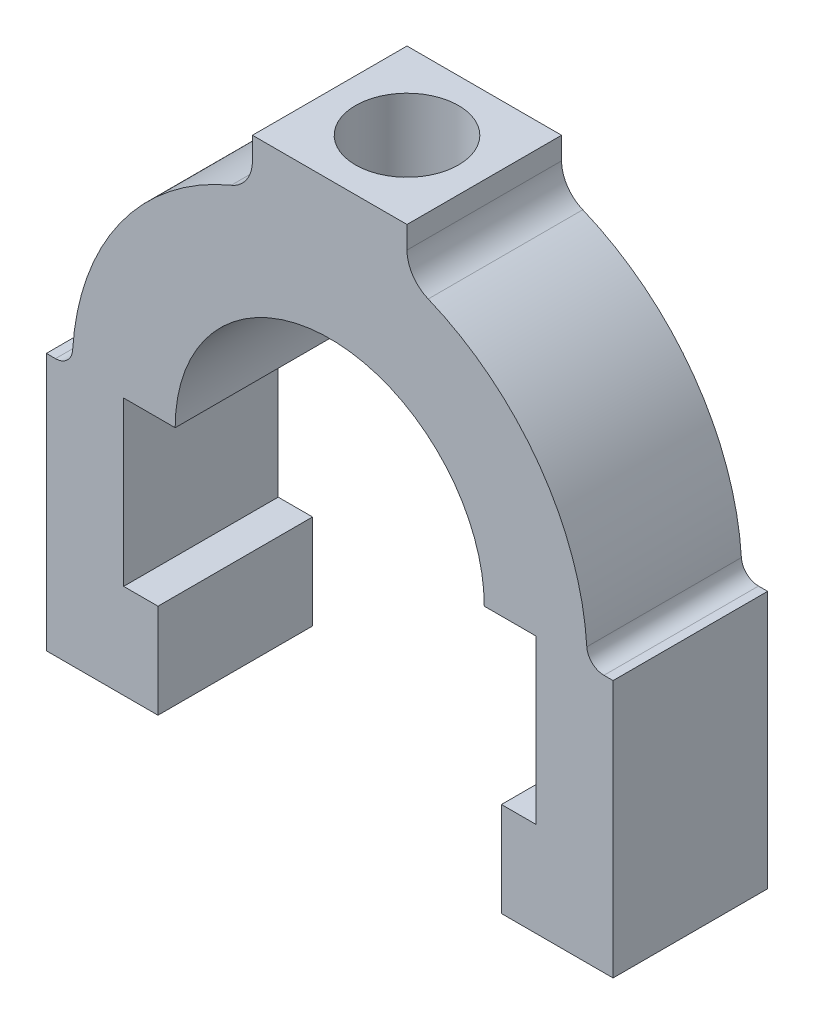
ISO-10303-21;
HEADER;
FILE_DESCRIPTION(('STEP AP214'),'2;1');
FILE_NAME('part.step','',(''),(''),'','','');
FILE_SCHEMA(('AUTOMOTIVE_DESIGN { 1 0 10303 214 1 1 1 1 }'));
ENDSEC;
DATA;
#1=APPLICATION_CONTEXT('core data for automotive mechanical design processes');
#2=APPLICATION_PROTOCOL_DEFINITION('international standard','automotive_design',2000,#1);
#3=PRODUCT_CONTEXT('',#1,'mechanical');
#4=PRODUCT('Part','Part','',(#3));
#5=PRODUCT_RELATED_PRODUCT_CATEGORY('part','',(#4));
#6=PRODUCT_DEFINITION_FORMATION('','',#4);
#7=PRODUCT_DEFINITION_CONTEXT('part definition',#1,'design');
#8=PRODUCT_DEFINITION('design','',#6,#7);
#9=PRODUCT_DEFINITION_SHAPE('','',#8);
#10=(LENGTH_UNIT() NAMED_UNIT(*) SI_UNIT(.MILLI.,.METRE.));
#11=(NAMED_UNIT(*) PLANE_ANGLE_UNIT() SI_UNIT($,.RADIAN.));
#12=(NAMED_UNIT(*) SI_UNIT($,.STERADIAN.) SOLID_ANGLE_UNIT());
#13=UNCERTAINTY_MEASURE_WITH_UNIT(LENGTH_MEASURE(1.E-05),#10,'distance_accuracy_value','');
#14=(GEOMETRIC_REPRESENTATION_CONTEXT(3) GLOBAL_UNCERTAINTY_ASSIGNED_CONTEXT((#13)) GLOBAL_UNIT_ASSIGNED_CONTEXT((#10,
#11,#12)) REPRESENTATION_CONTEXT('',''));
#15=CARTESIAN_POINT('',(0.,0.,0.));
#16=DIRECTION('',(0.,0.,1.));
#17=DIRECTION('',(1.,0.,0.));
#18=AXIS2_PLACEMENT_3D('',#15,#16,#17);
#19=CARTESIAN_POINT('',(-9.,34.,9.));
#20=DIRECTION('',(0.,-1.,0.));
#21=DIRECTION('',(0.,0.,-1.));
#22=AXIS2_PLACEMENT_3D('',#19,#20,#21);
#23=PLANE('',#22);
#24=DIRECTION('',(-1.,0.,0.));
#25=VECTOR('',#24,1.);
#26=CARTESIAN_POINT('',(-9.,34.,-9.));
#27=LINE('',#26,#25);
#28=CARTESIAN_POINT('',(9.,34.,-9.));
#29=VERTEX_POINT('',#28);
#30=CARTESIAN_POINT('',(-9.,34.,-9.));
#31=VERTEX_POINT('',#30);
#32=EDGE_CURVE('E267',#29,#31,#27,.T.);
#33=ORIENTED_EDGE('',*,*,#32,.T.);
#34=DIRECTION('',(0.,0.,-1.));
#35=VECTOR('',#34,1.);
#36=CARTESIAN_POINT('',(-9.,34.,9.));
#37=LINE('',#36,#35);
#38=CARTESIAN_POINT('',(-9.,34.,9.));
#39=VERTEX_POINT('',#38);
#40=EDGE_CURVE('E225',#39,#31,#37,.T.);
#41=ORIENTED_EDGE('',*,*,#40,.F.);
#42=DIRECTION('',(-1.,0.,0.));
#43=VECTOR('',#42,1.);
#44=CARTESIAN_POINT('',(-9.,34.,9.));
#45=LINE('',#44,#43);
#46=CARTESIAN_POINT('',(9.,34.,9.));
#47=VERTEX_POINT('',#46);
#48=EDGE_CURVE('E202',#47,#39,#45,.T.);
#49=ORIENTED_EDGE('',*,*,#48,.F.);
#50=DIRECTION('',(0.,0.,-1.));
#51=VECTOR('',#50,1.);
#52=CARTESIAN_POINT('',(9.,34.,9.));
#53=LINE('',#52,#51);
#54=EDGE_CURVE('E214',#47,#29,#53,.T.);
#55=ORIENTED_EDGE('',*,*,#54,.T.);
#56=EDGE_LOOP('',(#33,#41,#49,#55));
#57=FACE_BOUND('',#56,.T.);
#58=CARTESIAN_POINT('',(0.,34.,0.));
#59=DIRECTION('',(0.,1.,0.));
#60=DIRECTION('',(0.,0.,1.));
#61=AXIS2_PLACEMENT_3D('',#58,#59,#60);
#62=CIRCLE('',#61,6.00000000000001);
#63=CARTESIAN_POINT('',(0.,34.,6.00000000000001));
#64=VERTEX_POINT('',#63);
#65=EDGE_CURVE('E518',#64,#64,#62,.T.);
#66=ORIENTED_EDGE('',*,*,#65,.F.);
#67=EDGE_LOOP('',(#66));
#68=FACE_BOUND('',#67,.T.);
#69=ADVANCED_FACE('F39',(#57,#68),#23,.F.);
#70=CARTESIAN_POINT('',(0.,0.,9.));
#71=DIRECTION('',(0.,0.,-1.));
#72=DIRECTION('',(-1.,0.,0.));
#73=AXIS2_PLACEMENT_3D('',#70,#71,#72);
#74=CYLINDRICAL_SURFACE('',#73,30.);
#75=CARTESIAN_POINT('',(0.,0.,9.));
#76=DIRECTION('',(0.,0.,1.));
#77=DIRECTION('',(1.,0.,0.));
#78=AXIS2_PLACEMENT_3D('',#75,#76,#77);
#79=CIRCLE('',#78,30.);
#80=CARTESIAN_POINT('',(29.9413489175087,1.875,9.));
#81=VERTEX_POINT('',#80);
#82=CARTESIAN_POINT('',(11.4705882352941,27.7204907160088,9.));
#83=VERTEX_POINT('',#82);
#84=EDGE_CURVE('E215',#81,#83,#79,.T.);
#85=ORIENTED_EDGE('',*,*,#84,.F.);
#86=DIRECTION('',(0.,0.,-1.));
#87=VECTOR('',#86,1.);
#88=CARTESIAN_POINT('',(29.9413489175087,1.875,9.));
#89=LINE('',#88,#87);
#90=CARTESIAN_POINT('',(29.9413489175087,1.875,-9.));
#91=VERTEX_POINT('',#90);
#92=EDGE_CURVE('E368',#81,#91,#89,.T.);
#93=ORIENTED_EDGE('',*,*,#92,.T.);
#94=CARTESIAN_POINT('',(0.,0.,-9.));
#95=DIRECTION('',(0.,0.,1.));
#96=DIRECTION('',(1.,0.,0.));
#97=AXIS2_PLACEMENT_3D('',#94,#95,#96);
#98=CIRCLE('',#97,30.);
#99=CARTESIAN_POINT('',(11.4705882352941,27.7204907160088,-9.));
#100=VERTEX_POINT('',#99);
#101=EDGE_CURVE('E264',#91,#100,#98,.T.);
#102=ORIENTED_EDGE('',*,*,#101,.T.);
#103=DIRECTION('',(0.,0.,-1.));
#104=VECTOR('',#103,1.);
#105=CARTESIAN_POINT('',(11.4705882352941,27.7204907160088,9.));
#106=LINE('',#105,#104);
#107=EDGE_CURVE('E353',#100,#83,#106,.F.);
#108=ORIENTED_EDGE('',*,*,#107,.T.);
#109=EDGE_LOOP('',(#85,#93,#102,#108));
#110=FACE_BOUND('',#109,.T.);
#111=ADVANCED_FACE('F384',(#110),#74,.T.);
#112=CARTESIAN_POINT('',(9.,34.,9.));
#113=DIRECTION('',(-1.,0.,0.));
#114=DIRECTION('',(0.,0.,1.));
#115=AXIS2_PLACEMENT_3D('',#112,#113,#114);
#116=PLANE('',#115);
#117=DIRECTION('',(0.,1.,0.));
#118=VECTOR('',#117,1.);
#119=CARTESIAN_POINT('',(9.,34.,9.));
#120=LINE('',#119,#118);
#121=CARTESIAN_POINT('',(9.,31.41655614481,9.));
#122=VERTEX_POINT('',#121);
#123=EDGE_CURVE('E200',#122,#47,#120,.T.);
#124=ORIENTED_EDGE('',*,*,#123,.F.);
#125=DIRECTION('',(0.,0.,1.));
#126=VECTOR('',#125,1.);
#127=CARTESIAN_POINT('',(9.,31.41655614481,-9.));
#128=LINE('',#127,#126);
#129=CARTESIAN_POINT('',(9.,31.41655614481,-9.));
#130=VERTEX_POINT('',#129);
#131=EDGE_CURVE('E354',#122,#130,#128,.F.);
#132=ORIENTED_EDGE('',*,*,#131,.T.);
#133=DIRECTION('',(0.,1.,0.));
#134=VECTOR('',#133,1.);
#135=CARTESIAN_POINT('',(9.,34.,-9.));
#136=LINE('',#135,#134);
#137=EDGE_CURVE('E217',#130,#29,#136,.T.);
#138=ORIENTED_EDGE('',*,*,#137,.T.);
#139=ORIENTED_EDGE('',*,*,#54,.F.);
#140=EDGE_LOOP('',(#124,#132,#138,#139));
#141=FACE_BOUND('',#140,.T.);
#142=ADVANCED_FACE('F216',(#141),#116,.F.);
#143=CARTESIAN_POINT('',(-9.,28.6181760425084,9.));
#144=DIRECTION('',(1.,0.,0.));
#145=DIRECTION('',(0.,0.,-1.));
#146=AXIS2_PLACEMENT_3D('',#143,#144,#145);
#147=PLANE('',#146);
#148=DIRECTION('',(0.,-1.,0.));
#149=VECTOR('',#148,1.);
#150=CARTESIAN_POINT('',(-9.,28.6181760425084,-9.));
#151=LINE('',#150,#149);
#152=CARTESIAN_POINT('',(-9.,31.41655614481,-9.));
#153=VERTEX_POINT('',#152);
#154=EDGE_CURVE('E271',#31,#153,#151,.T.);
#155=ORIENTED_EDGE('',*,*,#154,.T.);
#156=DIRECTION('',(0.,0.,1.));
#157=VECTOR('',#156,1.);
#158=CARTESIAN_POINT('',(-9.,31.41655614481,9.));
#159=LINE('',#158,#157);
#160=CARTESIAN_POINT('',(-9.,31.41655614481,9.));
#161=VERTEX_POINT('',#160);
#162=EDGE_CURVE('E352',#153,#161,#159,.T.);
#163=ORIENTED_EDGE('',*,*,#162,.T.);
#164=DIRECTION('',(0.,-1.,0.));
#165=VECTOR('',#164,1.);
#166=CARTESIAN_POINT('',(-9.,28.6181760425084,9.));
#167=LINE('',#166,#165);
#168=EDGE_CURVE('E230',#39,#161,#167,.T.);
#169=ORIENTED_EDGE('',*,*,#168,.F.);
#170=ORIENTED_EDGE('',*,*,#40,.T.);
#171=EDGE_LOOP('',(#155,#163,#169,#170));
#172=FACE_BOUND('',#171,.T.);
#173=ADVANCED_FACE('F471',(#172),#147,.F.);
#174=CARTESIAN_POINT('',(0.,0.,9.));
#175=DIRECTION('',(0.,0.,-1.));
#176=DIRECTION('',(-1.,0.,0.));
#177=AXIS2_PLACEMENT_3D('',#174,#175,#176);
#178=CYLINDRICAL_SURFACE('',#177,30.);
#179=CARTESIAN_POINT('',(0.,0.,-9.));
#180=DIRECTION('',(0.,0.,1.));
#181=DIRECTION('',(1.,0.,0.));
#182=AXIS2_PLACEMENT_3D('',#179,#180,#181);
#183=CIRCLE('',#182,30.);
#184=CARTESIAN_POINT('',(-11.4705882352941,27.7204907160088,-9.));
#185=VERTEX_POINT('',#184);
#186=CARTESIAN_POINT('',(-29.9413489175087,1.875,-9.));
#187=VERTEX_POINT('',#186);
#188=EDGE_CURVE('E273',#185,#187,#183,.T.);
#189=ORIENTED_EDGE('',*,*,#188,.T.);
#190=DIRECTION('',(0.,0.,-1.));
#191=VECTOR('',#190,1.);
#192=CARTESIAN_POINT('',(-29.9413489175087,1.875,9.));
#193=LINE('',#192,#191);
#194=CARTESIAN_POINT('',(-29.9413489175087,1.875,9.));
#195=VERTEX_POINT('',#194);
#196=EDGE_CURVE('E58',#187,#195,#193,.F.);
#197=ORIENTED_EDGE('',*,*,#196,.T.);
#198=CARTESIAN_POINT('',(0.,0.,9.));
#199=DIRECTION('',(0.,0.,1.));
#200=DIRECTION('',(1.,0.,0.));
#201=AXIS2_PLACEMENT_3D('',#198,#199,#200);
#202=CIRCLE('',#201,30.);
#203=CARTESIAN_POINT('',(-11.4705882352941,27.7204907160088,9.));
#204=VERTEX_POINT('',#203);
#205=EDGE_CURVE('E226',#204,#195,#202,.T.);
#206=ORIENTED_EDGE('',*,*,#205,.F.);
#207=DIRECTION('',(0.,0.,-1.));
#208=VECTOR('',#207,1.);
#209=CARTESIAN_POINT('',(-11.4705882352941,27.7204907160088,9.));
#210=LINE('',#209,#208);
#211=EDGE_CURVE('E222',#204,#185,#210,.T.);
#212=ORIENTED_EDGE('',*,*,#211,.T.);
#213=EDGE_LOOP('',(#189,#197,#206,#212));
#214=FACE_BOUND('',#213,.T.);
#215=ADVANCED_FACE('F470',(#214),#178,.T.);
#216=CARTESIAN_POINT('',(-33.,0.,9.));
#217=DIRECTION('',(0.,-1.,0.));
#218=DIRECTION('',(0.,0.,-1.));
#219=AXIS2_PLACEMENT_3D('',#216,#217,#218);
#220=PLANE('',#219);
#221=DIRECTION('',(-1.,0.,0.));
#222=VECTOR('',#221,1.);
#223=CARTESIAN_POINT('',(-33.,0.,9.));
#224=LINE('',#223,#222);
#225=CARTESIAN_POINT('',(-31.9374388453426,0.,9.));
#226=VERTEX_POINT('',#225);
#227=CARTESIAN_POINT('',(-33.,0.,9.));
#228=VERTEX_POINT('',#227);
#229=EDGE_CURVE('E234',#226,#228,#224,.T.);
#230=ORIENTED_EDGE('',*,*,#229,.F.);
#231=DIRECTION('',(0.,0.,1.));
#232=VECTOR('',#231,1.);
#233=CARTESIAN_POINT('',(-31.9374388453426,0.,-9.));
#234=LINE('',#233,#232);
#235=CARTESIAN_POINT('',(-31.9374388453426,0.,-9.));
#236=VERTEX_POINT('',#235);
#237=EDGE_CURVE('E371',#226,#236,#234,.F.);
#238=ORIENTED_EDGE('',*,*,#237,.T.);
#239=DIRECTION('',(-1.,0.,0.));
#240=VECTOR('',#239,1.);
#241=CARTESIAN_POINT('',(-33.,0.,-9.));
#242=LINE('',#241,#240);
#243=CARTESIAN_POINT('',(-33.,0.,-9.));
#244=VERTEX_POINT('',#243);
#245=EDGE_CURVE('E277',#236,#244,#242,.T.);
#246=ORIENTED_EDGE('',*,*,#245,.T.);
#247=DIRECTION('',(0.,0.,-1.));
#248=VECTOR('',#247,1.);
#249=CARTESIAN_POINT('',(-33.,0.,9.));
#250=LINE('',#249,#248);
#251=EDGE_CURVE('E342',#228,#244,#250,.T.);
#252=ORIENTED_EDGE('',*,*,#251,.F.);
#253=EDGE_LOOP('',(#230,#238,#246,#252));
#254=FACE_BOUND('',#253,.T.);
#255=ADVANCED_FACE('F462',(#254),#220,.F.);
#256=CARTESIAN_POINT('',(-33.,-30.,9.));
#257=DIRECTION('',(1.,0.,0.));
#258=DIRECTION('',(0.,0.,-1.));
#259=AXIS2_PLACEMENT_3D('',#256,#257,#258);
#260=PLANE('',#259);
#261=DIRECTION('',(0.,-1.,0.));
#262=VECTOR('',#261,1.);
#263=CARTESIAN_POINT('',(-33.,-30.,-9.));
#264=LINE('',#263,#262);
#265=CARTESIAN_POINT('',(-33.,-30.,-9.));
#266=VERTEX_POINT('',#265);
#267=EDGE_CURVE('E279',#244,#266,#264,.T.);
#268=ORIENTED_EDGE('',*,*,#267,.T.);
#269=DIRECTION('',(0.,0.,-1.));
#270=VECTOR('',#269,1.);
#271=CARTESIAN_POINT('',(-33.,-30.,9.));
#272=LINE('',#271,#270);
#273=CARTESIAN_POINT('',(-33.,-30.,9.));
#274=VERTEX_POINT('',#273);
#275=EDGE_CURVE('E345',#274,#266,#272,.T.);
#276=ORIENTED_EDGE('',*,*,#275,.F.);
#277=DIRECTION('',(0.,-1.,0.));
#278=VECTOR('',#277,1.);
#279=CARTESIAN_POINT('',(-33.,-30.,9.));
#280=LINE('',#279,#278);
#281=EDGE_CURVE('E237',#228,#274,#280,.T.);
#282=ORIENTED_EDGE('',*,*,#281,.F.);
#283=ORIENTED_EDGE('',*,*,#251,.T.);
#284=EDGE_LOOP('',(#268,#276,#282,#283));
#285=FACE_BOUND('',#284,.T.);
#286=ADVANCED_FACE('F460',(#285),#260,.F.);
#287=CARTESIAN_POINT('',(-20.,-30.,9.));
#288=DIRECTION('',(0.,1.,0.));
#289=DIRECTION('',(0.,0.,1.));
#290=AXIS2_PLACEMENT_3D('',#287,#288,#289);
#291=PLANE('',#290);
#292=DIRECTION('',(1.,0.,0.));
#293=VECTOR('',#292,1.);
#294=CARTESIAN_POINT('',(-20.,-30.,-9.));
#295=LINE('',#294,#293);
#296=CARTESIAN_POINT('',(-20.,-30.,-9.));
#297=VERTEX_POINT('',#296);
#298=EDGE_CURVE('E278',#266,#297,#295,.T.);
#299=ORIENTED_EDGE('',*,*,#298,.T.);
#300=DIRECTION('',(0.,0.,-1.));
#301=VECTOR('',#300,1.);
#302=CARTESIAN_POINT('',(-20.,-30.,9.));
#303=LINE('',#302,#301);
#304=CARTESIAN_POINT('',(-20.,-30.,9.));
#305=VERTEX_POINT('',#304);
#306=EDGE_CURVE('E336',#305,#297,#303,.T.);
#307=ORIENTED_EDGE('',*,*,#306,.F.);
#308=DIRECTION('',(1.,0.,0.));
#309=VECTOR('',#308,1.);
#310=CARTESIAN_POINT('',(-20.,-30.,9.));
#311=LINE('',#310,#309);
#312=EDGE_CURVE('E236',#274,#305,#311,.T.);
#313=ORIENTED_EDGE('',*,*,#312,.F.);
#314=ORIENTED_EDGE('',*,*,#275,.T.);
#315=EDGE_LOOP('',(#299,#307,#313,#314));
#316=FACE_BOUND('',#315,.T.);
#317=ADVANCED_FACE('F451',(#316),#291,.F.);
#318=CARTESIAN_POINT('',(-20.,-19.,9.));
#319=DIRECTION('',(-1.,0.,0.));
#320=DIRECTION('',(0.,-1.,0.));
#321=AXIS2_PLACEMENT_3D('',#318,#319,#320);
#322=PLANE('',#321);
#323=DIRECTION('',(0.,1.,0.));
#324=VECTOR('',#323,1.);
#325=CARTESIAN_POINT('',(-20.,-19.,-9.));
#326=LINE('',#325,#324);
#327=CARTESIAN_POINT('',(-20.,-19.,-9.));
#328=VERTEX_POINT('',#327);
#329=EDGE_CURVE('E285',#297,#328,#326,.T.);
#330=ORIENTED_EDGE('',*,*,#329,.T.);
#331=DIRECTION('',(0.,0.,-1.));
#332=VECTOR('',#331,1.);
#333=CARTESIAN_POINT('',(-20.,-19.,9.));
#334=LINE('',#333,#332);
#335=CARTESIAN_POINT('',(-20.,-19.,9.));
#336=VERTEX_POINT('',#335);
#337=EDGE_CURVE('E337',#336,#328,#334,.T.);
#338=ORIENTED_EDGE('',*,*,#337,.F.);
#339=DIRECTION('',(0.,1.,0.));
#340=VECTOR('',#339,1.);
#341=CARTESIAN_POINT('',(-20.,-19.,9.));
#342=LINE('',#341,#340);
#343=EDGE_CURVE('E238',#305,#336,#342,.T.);
#344=ORIENTED_EDGE('',*,*,#343,.F.);
#345=ORIENTED_EDGE('',*,*,#306,.T.);
#346=EDGE_LOOP('',(#330,#338,#344,#345));
#347=FACE_BOUND('',#346,.T.);
#348=ADVANCED_FACE('F449',(#347),#322,.F.);
#349=CARTESIAN_POINT('',(-24.,-19.,9.));
#350=DIRECTION('',(0.,-1.,0.));
#351=DIRECTION('',(0.,0.,-1.));
#352=AXIS2_PLACEMENT_3D('',#349,#350,#351);
#353=PLANE('',#352);
#354=DIRECTION('',(-1.,0.,0.));
#355=VECTOR('',#354,1.);
#356=CARTESIAN_POINT('',(-24.,-19.,-9.));
#357=LINE('',#356,#355);
#358=CARTESIAN_POINT('',(-24.,-19.,-9.));
#359=VERTEX_POINT('',#358);
#360=EDGE_CURVE('E281',#328,#359,#357,.T.);
#361=ORIENTED_EDGE('',*,*,#360,.T.);
#362=DIRECTION('',(0.,0.,-1.));
#363=VECTOR('',#362,1.);
#364=CARTESIAN_POINT('',(-24.,-19.,9.));
#365=LINE('',#364,#363);
#366=CARTESIAN_POINT('',(-24.,-19.,9.));
#367=VERTEX_POINT('',#366);
#368=EDGE_CURVE('E334',#367,#359,#365,.T.);
#369=ORIENTED_EDGE('',*,*,#368,.F.);
#370=DIRECTION('',(-1.,0.,0.));
#371=VECTOR('',#370,1.);
#372=CARTESIAN_POINT('',(-24.,-19.,9.));
#373=LINE('',#372,#371);
#374=EDGE_CURVE('E245',#336,#367,#373,.T.);
#375=ORIENTED_EDGE('',*,*,#374,.F.);
#376=ORIENTED_EDGE('',*,*,#337,.T.);
#377=EDGE_LOOP('',(#361,#369,#375,#376));
#378=FACE_BOUND('',#377,.T.);
#379=ADVANCED_FACE('F445',(#378),#353,.F.);
#380=CARTESIAN_POINT('',(-24.,0.,9.));
#381=DIRECTION('',(-1.,0.,0.));
#382=DIRECTION('',(0.,-1.,0.));
#383=AXIS2_PLACEMENT_3D('',#380,#381,#382);
#384=PLANE('',#383);
#385=DIRECTION('',(0.,1.,0.));
#386=VECTOR('',#385,1.);
#387=CARTESIAN_POINT('',(-24.,0.,-9.));
#388=LINE('',#387,#386);
#389=CARTESIAN_POINT('',(-24.,0.,-9.));
#390=VERTEX_POINT('',#389);
#391=EDGE_CURVE('E288',#359,#390,#388,.T.);
#392=ORIENTED_EDGE('',*,*,#391,.T.);
#393=DIRECTION('',(0.,0.,-1.));
#394=VECTOR('',#393,1.);
#395=CARTESIAN_POINT('',(-24.,0.,9.));
#396=LINE('',#395,#394);
#397=CARTESIAN_POINT('',(-24.,0.,9.));
#398=VERTEX_POINT('',#397);
#399=EDGE_CURVE('E329',#398,#390,#396,.T.);
#400=ORIENTED_EDGE('',*,*,#399,.F.);
#401=DIRECTION('',(0.,1.,0.));
#402=VECTOR('',#401,1.);
#403=CARTESIAN_POINT('',(-24.,0.,9.));
#404=LINE('',#403,#402);
#405=EDGE_CURVE('E241',#367,#398,#404,.T.);
#406=ORIENTED_EDGE('',*,*,#405,.F.);
#407=ORIENTED_EDGE('',*,*,#368,.T.);
#408=EDGE_LOOP('',(#392,#400,#406,#407));
#409=FACE_BOUND('',#408,.T.);
#410=ADVANCED_FACE('F437',(#409),#384,.F.);
#411=CARTESIAN_POINT('',(-18.,0.,9.));
#412=DIRECTION('',(0.,1.,0.));
#413=DIRECTION('',(-1.,0.,0.));
#414=AXIS2_PLACEMENT_3D('',#411,#412,#413);
#415=PLANE('',#414);
#416=DIRECTION('',(1.,0.,0.));
#417=VECTOR('',#416,1.);
#418=CARTESIAN_POINT('',(-18.,0.,-9.));
#419=LINE('',#418,#417);
#420=CARTESIAN_POINT('',(-18.,0.,-9.));
#421=VERTEX_POINT('',#420);
#422=EDGE_CURVE('E286',#390,#421,#419,.T.);
#423=ORIENTED_EDGE('',*,*,#422,.T.);
#424=DIRECTION('',(0.,0.,-1.));
#425=VECTOR('',#424,1.);
#426=CARTESIAN_POINT('',(-18.,0.,9.));
#427=LINE('',#426,#425);
#428=CARTESIAN_POINT('',(-18.,0.,9.));
#429=VERTEX_POINT('',#428);
#430=EDGE_CURVE('E330',#429,#421,#427,.T.);
#431=ORIENTED_EDGE('',*,*,#430,.F.);
#432=DIRECTION('',(1.,0.,0.));
#433=VECTOR('',#432,1.);
#434=CARTESIAN_POINT('',(-18.,0.,9.));
#435=LINE('',#434,#433);
#436=EDGE_CURVE('E248',#398,#429,#435,.T.);
#437=ORIENTED_EDGE('',*,*,#436,.F.);
#438=ORIENTED_EDGE('',*,*,#399,.T.);
#439=EDGE_LOOP('',(#423,#431,#437,#438));
#440=FACE_BOUND('',#439,.T.);
#441=ADVANCED_FACE('F433',(#440),#415,.F.);
#442=CARTESIAN_POINT('',(0.,0.,9.));
#443=DIRECTION('',(0.,0.,-1.));
#444=DIRECTION('',(-1.,0.,0.));
#445=AXIS2_PLACEMENT_3D('',#442,#443,#444);
#446=CYLINDRICAL_SURFACE('',#445,18.);
#447=CARTESIAN_POINT('',(0.,18.,6.00000000000001));
#448=CARTESIAN_POINT('',(0.327379650289655,18.000001123506,6.0000023265047));
#449=CARTESIAN_POINT('',(0.654748688533562,17.9909867942918,5.97312070517746));
#450=CARTESIAN_POINT('',(1.29985304419291,17.9559119882929,5.86662304491696));
#451=CARTESIAN_POINT('',(1.61758735790782,17.9298497418759,5.78700153139131));
#452=CARTESIAN_POINT('',(2.23398736346928,17.8635207608215,5.57809293059833));
#453=CARTESIAN_POINT('',(2.53268396310175,17.8232777801419,5.44888886636663));
#454=CARTESIAN_POINT('',(3.1042846199529,17.7326582250689,5.14472171568156));
#455=CARTESIAN_POINT('',(3.37718357480982,17.6822796521554,4.96974960271144));
#456=CARTESIAN_POINT('',(3.76616319556052,17.6021139762513,4.67373393790122));
#457=CARTESIAN_POINT('',(3.8942294180292,17.5741584828372,4.56756247056504));
#458=CARTESIAN_POINT('',(4.14103139160447,17.5176437471481,4.34504566324369));
#459=CARTESIAN_POINT('',(4.25977020760167,17.4890847071399,4.22870369195644));
#460=CARTESIAN_POINT('',(4.48726302616458,17.4321038412202,3.98649013598117));
#461=CARTESIAN_POINT('',(4.59601129158695,17.4036821029209,3.86061315050774));
#462=CARTESIAN_POINT('',(4.80273826983802,17.3477712002834,3.60018484220802));
#463=CARTESIAN_POINT('',(4.90072088829396,17.3202817002612,3.46563669345216));
#464=CARTESIAN_POINT('',(5.08800724585023,17.2662087032665,3.18457637712881));
#465=CARTESIAN_POINT('',(5.17697354503101,17.2396751826829,3.03782944671992));
#466=CARTESIAN_POINT('',(5.34214016777295,17.1892116232901,2.736964636426));
#467=CARTESIAN_POINT('',(5.41834554335251,17.1652805554979,2.58284970472632));
#468=CARTESIAN_POINT('',(5.55741169583797,17.1207625674418,2.2682071931852));
#469=CARTESIAN_POINT('',(5.62027009739617,17.1001762425913,2.10767847791904));
#470=CARTESIAN_POINT('',(5.73202691492454,17.0630401245342,1.78145414427482));
#471=CARTESIAN_POINT('',(5.78093169214337,17.0464884924745,1.615760918658));
#472=CARTESIAN_POINT('',(5.86294638495678,17.0184510407943,1.2859862068502));
#473=CARTESIAN_POINT('',(5.89652807287009,17.0068148729862,1.12203481043606));
#474=CARTESIAN_POINT('',(5.94988922941377,16.9882200160252,0.79170422793202));
#475=CARTESIAN_POINT('',(5.96967445275638,16.981259376684,0.625326083675578));
#476=CARTESIAN_POINT('',(5.99526000389047,16.972243291642,0.291376402534221));
#477=CARTESIAN_POINT('',(6.00106129575105,16.9701875077948,0.123804948716408));
#478=CARTESIAN_POINT('',(5.99862030680245,16.9710505580302,-0.211220264603541));
#479=CARTESIAN_POINT('',(5.99037842226284,16.9739692517434,-0.378674027293289));
#480=CARTESIAN_POINT('',(5.96063984942074,16.9844341754675,-0.7044792823855));
#481=CARTESIAN_POINT('',(5.93976958041475,16.9917616219287,-0.862895480150735));
#482=CARTESIAN_POINT('',(5.88551353932248,17.0106306342449,-1.17736899795067));
#483=CARTESIAN_POINT('',(5.8521235554091,17.0221736182384,-1.33342550574807));
#484=CARTESIAN_POINT('',(5.7731374155462,17.0491237940853,-1.64202527661949));
#485=CARTESIAN_POINT('',(5.72754467937087,17.0645299032367,-1.79456951100698));
#486=CARTESIAN_POINT('',(5.62451111134525,17.0987666198765,-2.09526716026518));
#487=CARTESIAN_POINT('',(5.5670657806024,17.1175985273741,-2.24341888337636));
#488=CARTESIAN_POINT('',(5.43978996961935,17.1584737023369,-2.53665776063388));
#489=CARTESIAN_POINT('',(5.36977902106655,17.1805627911335,-2.68166015095766));
#490=CARTESIAN_POINT('',(5.21849496708249,17.2271173682882,-2.96532612102853));
#491=CARTESIAN_POINT('',(5.13721801376243,17.2515836677221,-3.1039875134049));
#492=CARTESIAN_POINT('',(4.96396506342481,17.3022308894506,-3.37413724932027));
#493=CARTESIAN_POINT('',(4.87198833374049,17.3284119291083,-3.50562510074467));
#494=CARTESIAN_POINT('',(4.67791711233443,17.3818071133135,-3.76068799264569));
#495=CARTESIAN_POINT('',(4.57582226284314,17.4090212943713,-3.8842627530665));
#496=CARTESIAN_POINT('',(4.35651092167621,17.4652307681598,-4.12906952466076));
#497=CARTESIAN_POINT('',(4.23878222552779,17.4942446291105,-4.24983892079909));
#498=CARTESIAN_POINT('',(3.99356544234078,17.5518457645374,-4.48105174840133));
#499=CARTESIAN_POINT('',(3.86608044237211,17.5804331705585,-4.5914984217909));
#500=CARTESIAN_POINT('',(3.60203839398285,17.6364264431102,-4.80143514826751));
#501=CARTESIAN_POINT('',(3.46547705844156,17.66383174106,-4.90091996380797));
#502=CARTESIAN_POINT('',(3.18424141551367,17.716688947922,-5.08813625898337));
#503=CARTESIAN_POINT('',(3.03957034912589,17.7421416276874,-5.17587238706145));
#504=CARTESIAN_POINT('',(2.74144779789668,17.7906577486565,-5.33982218022585));
#505=CARTESIAN_POINT('',(2.58792073088706,17.8136936325711,-5.41590672225529));
#506=CARTESIAN_POINT('',(2.27458592506743,17.8564062976005,-5.55478281972534));
#507=CARTESIAN_POINT('',(2.11478068961971,17.8760844012064,-5.61757961101265));
#508=CARTESIAN_POINT('',(1.78999322259957,17.9115215641534,-5.72934687582175));
#509=CARTESIAN_POINT('',(1.62501139705281,17.9272809299996,-5.77831843072819));
#510=CARTESIAN_POINT('',(1.29111086658729,17.954416785468,-5.86196640014444));
#511=CARTESIAN_POINT('',(1.12219234324136,17.9657934768103,-5.89664347258733));
#512=CARTESIAN_POINT('',(0.789168788155049,17.9834311786537,-5.95016009506113));
#513=CARTESIAN_POINT('',(0.625174437128371,17.9898933737321,-5.96962351896456));
#514=CARTESIAN_POINT('',(0.295964203150346,17.9983200246331,-5.99497023123316));
#515=CARTESIAN_POINT('',(0.130747919465905,18.0002829327427,-6.00084884655548));
#516=CARTESIAN_POINT('',(-0.199509552434278,17.9996513983649,-5.99895414534772));
#517=CARTESIAN_POINT('',(-0.364550787039312,17.9970593541922,-5.99118801317439));
#518=CARTESIAN_POINT('',(-0.693361592702056,17.9873931413008,-5.96208858365364));
#519=CARTESIAN_POINT('',(-0.857130672286748,17.9803173198124,-5.94075028344478));
#520=CARTESIAN_POINT('',(-1.17733651912546,17.9621501229369,-5.885532591795));
#521=CARTESIAN_POINT('',(-1.33384731153101,17.9511829004167,-5.85204028867007));
#522=CARTESIAN_POINT('',(-1.64345814456253,17.9254899139335,-5.77274582664115));
#523=CARTESIAN_POINT('',(-1.79655695572469,17.910762818218,-5.72693930571761));
#524=CARTESIAN_POINT('',(-2.09825654984181,17.8779285210375,-5.62340992963252));
#525=CARTESIAN_POINT('',(-2.24685853242728,17.8598222304539,-5.56569028527877));
#526=CARTESIAN_POINT('',(-2.53870192503155,17.8206824064423,-5.43878203882837));
#527=CARTESIAN_POINT('',(-2.68194138840117,17.7996478228409,-5.36958932043647));
#528=CARTESIAN_POINT('',(-3.10955308705348,17.7317545667084,-5.14165694660145));
#529=CARTESIAN_POINT('',(-3.38410495409262,17.6809813742354,-4.96520880969209));
#530=CARTESIAN_POINT('',(-3.90046380489828,17.5743027422683,-4.57077871329004));
#531=CARTESIAN_POINT('',(-4.14226074948704,17.5183957380628,-4.35278406910609));
#532=CARTESIAN_POINT('',(-4.48120075410062,17.4336826212657,-3.9934553932898));
#533=CARTESIAN_POINT('',(-4.59235115980605,17.4046627531,-3.86511883684042));
#534=CARTESIAN_POINT('',(-4.80346249277619,17.3475844522084,-3.59937617807721));
#535=CARTESIAN_POINT('',(-4.9034273442786,17.3195256847111,-3.46197328357882));
#536=CARTESIAN_POINT('',(-5.09152241657998,17.2651671618791,-3.17888353544383));
#537=CARTESIAN_POINT('',(-5.17964753663559,17.2388681671157,-3.03319314965323));
#538=CARTESIAN_POINT('',(-5.34332580832153,17.1888391626455,-2.73456481947393));
#539=CARTESIAN_POINT('',(-5.41888421002776,17.1651080815805,-2.5816299361471));
#540=CARTESIAN_POINT('',(-5.55674325657251,17.1209765842434,-2.26972057554985));
#541=CARTESIAN_POINT('',(-5.61906451465578,17.1005710011209,-2.11075594980541));
#542=CARTESIAN_POINT('',(-5.73001985812799,17.0637127452484,-1.78774169753998));
#543=CARTESIAN_POINT('',(-5.77865956483044,17.047258449448,-1.62369419025971));
#544=CARTESIAN_POINT('',(-5.86180765260837,17.0188467426427,-1.29169994447398));
#545=CARTESIAN_POINT('',(-5.89631843745229,17.0068885667365,-1.12375387437705));
#546=CARTESIAN_POINT('',(-5.95086210077739,16.9878803440501,-0.785254584220829));
#547=CARTESIAN_POINT('',(-5.97089570887974,16.980830049923,-0.614701495992562));
#548=CARTESIAN_POINT('',(-5.99561670735592,16.9721165300556,-0.281210688256413));
#549=CARTESIAN_POINT('',(-6.00104252908575,16.9701941359792,-0.118334053779586));
#550=CARTESIAN_POINT('',(-5.99862718574831,16.971048132718,0.207366276937527));
#551=CARTESIAN_POINT('',(-5.99078151118915,16.9738261206655,0.370189936373841));
#552=CARTESIAN_POINT('',(-5.96189837770534,16.9839924705695,0.694443088382823));
#553=CARTESIAN_POINT('',(-5.94086667700385,16.9913788200877,0.855873158345247));
#554=CARTESIAN_POINT('',(-5.88580987344676,17.010528799585,1.17629853099465));
#555=CARTESIAN_POINT('',(-5.85177988955102,17.02229407387,1.33529289568337));
#556=CARTESIAN_POINT('',(-5.771827511472,17.0495675106714,1.64661267600511));
#557=CARTESIAN_POINT('',(-5.72614898895514,17.0649985214979,1.79900764331358));
#558=CARTESIAN_POINT('',(-5.62296574413083,17.0992751394136,2.09940161935454));
#559=CARTESIAN_POINT('',(-5.56545681111228,17.1181219619827,2.24739904137768));
#560=CARTESIAN_POINT('',(-5.43907961849349,17.1586949560773,2.5380139994258));
#561=CARTESIAN_POINT('',(-5.37021353557006,17.1804205757049,2.68063255992394));
#562=CARTESIAN_POINT('',(-5.22158108093291,17.2261759837312,2.95974746357768));
#563=CARTESIAN_POINT('',(-5.14181056316171,17.2502066475064,3.09624145171727));
#564=CARTESIAN_POINT('',(-4.96822239816028,17.3010197763056,3.36806664670174));
#565=CARTESIAN_POINT('',(-4.87394621391852,17.3278763260538,3.50309185339549));
#566=CARTESIAN_POINT('',(-4.67473803525017,17.3826786842874,3.76482594594378));
#567=CARTESIAN_POINT('',(-4.56980207786682,17.4106248954769,3.89153170986691));
#568=CARTESIAN_POINT('',(-4.23997033318675,17.4949712765604,4.2579908065868));
#569=CARTESIAN_POINT('',(-3.99991932392137,17.5519192865978,4.48429107663514));
#570=CARTESIAN_POINT('',(-3.47541732325492,17.6634103595779,4.9029084248834));
#571=CARTESIAN_POINT('',(-3.18960052896001,17.7177731925948,5.09355732051543));
#572=CARTESIAN_POINT('',(-2.5881526942897,17.815557186422,5.42393134196919));
#573=CARTESIAN_POINT('',(-2.27252930193346,17.8589811435868,5.56366948642237));
#574=CARTESIAN_POINT('',(-1.63495978805023,17.9283314877085,5.78233265049631));
#575=CARTESIAN_POINT('',(-1.31392615559421,17.9549529431752,5.86369571468174));
#576=CARTESIAN_POINT('',(-0.661922886417798,17.9907842260842,5.97252076721479));
#577=CARTESIAN_POINT('',(-0.33095602062439,17.9999988642206,5.99999764808006));
#578=CARTESIAN_POINT('',(0.,18.,6.00000000000001));
#579=B_SPLINE_CURVE_WITH_KNOTS('',3,(#447,#448,#449,#450,#451,#452,#453,#454,#455,#456,#457,
#458,#459,#460,#461,#462,#463,#464,#465,#466,#467,#468,#469,#470,#471,#472,#473,#474,#475,#476,
#477,#478,#479,#480,#481,#482,#483,#484,#485,#486,#487,#488,#489,#490,#491,#492,#493,#494,#495,
#496,#497,#498,#499,#500,#501,#502,#503,#504,#505,#506,#507,#508,#509,#510,#511,#512,#513,#514,
#515,#516,#517,#518,#519,#520,#521,#522,#523,#524,#525,#526,#527,#528,#529,#530,#531,#532,#533,
#534,#535,#536,#537,#538,#539,#540,#541,#542,#543,#544,#545,#546,#547,#548,#549,#550,#551,#552,
#553,#554,#555,#556,#557,#558,#559,#560,#561,#562,#563,#564,#565,#566,#567,#568,#569,#570,#571,
#572,#573,#574,#575,#576,#577,#578),.UNSPECIFIED.,.T.,.F.,(4,2,2,2,2,2,2,2,2,2,2,2,2,2,2,2,2,2,
2,2,2,2,2,2,2,2,2,2,2,2,2,2,2,2,2,2,2,2,2,2,2,2,2,2,2,2,2,2,2,2,2,2,2,2,2,2,2,2,2,2,2,2,2,2,2,
4),(0.,0.980922636156068,1.96194711160513,2.94133603722165,3.92091826679461,4.42650795800367,
4.93193081656493,5.43764212680677,5.94316936197256,6.46347458360147,6.98357332815681,
7.50376455673092,8.02371825760203,8.52635611322414,9.02878418544485,9.53117761867723,
10.0335568756344,10.5128532711172,10.9923110542535,11.4716346116346,11.9511404417982,
12.4381827239463,12.9253917665144,13.4126341903618,13.8998938489077,14.4127033790737,
14.9253513126936,15.4382431356103,15.9509314262095,16.4689439882804,16.9867520532929,
17.5045196050784,18.0222633228811,18.517462598168,19.0128321918786,19.5079410372374,
20.003232491415,20.4839646652066,20.9648673518609,21.4456405951742,21.9265867044307,
22.9127919780087,23.899298836698,24.4155088763846,24.931537242041,25.4477872128305,
25.9638209619367,26.4790451400542,26.9940573187272,27.5089818413857,28.0238804110535,
28.5122138127281,29.0007131774442,29.4889993671702,29.9774690958509,30.4564495222617,
30.9356007245367,31.4146602006447,31.8939023328471,32.3938860688241,32.8940563675105,
33.8936650334289,34.9322320161082,35.9705332351496,36.962445868431,37.9540843282906),.UNSPECIFIED.);
#580=CARTESIAN_POINT('',(0.,18.,6.00000000000001));
#581=VERTEX_POINT('',#580);
#582=EDGE_CURVE('E270',#581,#581,#579,.T.);
#583=ORIENTED_EDGE('',*,*,#582,.T.);
#584=EDGE_LOOP('',(#583));
#585=FACE_BOUND('',#584,.T.);
#586=CARTESIAN_POINT('',(0.,0.,-9.));
#587=DIRECTION('',(0.,0.,-1.));
#588=DIRECTION('',(1.,0.,0.));
#589=AXIS2_PLACEMENT_3D('',#586,#587,#588);
#590=CIRCLE('',#589,18.);
#591=CARTESIAN_POINT('',(18.,0.,-9.));
#592=VERTEX_POINT('',#591);
#593=EDGE_CURVE('E287',#421,#592,#590,.T.);
#594=ORIENTED_EDGE('',*,*,#593,.T.);
#595=DIRECTION('',(0.,0.,-1.));
#596=VECTOR('',#595,1.);
#597=CARTESIAN_POINT('',(18.,0.,9.));
#598=LINE('',#597,#596);
#599=CARTESIAN_POINT('',(18.,0.,9.));
#600=VERTEX_POINT('',#599);
#601=EDGE_CURVE('E322',#600,#592,#598,.T.);
#602=ORIENTED_EDGE('',*,*,#601,.F.);
#603=CARTESIAN_POINT('',(0.,0.,9.));
#604=DIRECTION('',(0.,0.,-1.));
#605=DIRECTION('',(1.,0.,0.));
#606=AXIS2_PLACEMENT_3D('',#603,#604,#605);
#607=CIRCLE('',#606,18.);
#608=EDGE_CURVE('E246',#429,#600,#607,.T.);
#609=ORIENTED_EDGE('',*,*,#608,.F.);
#610=ORIENTED_EDGE('',*,*,#430,.T.);
#611=EDGE_LOOP('',(#594,#602,#609,#610));
#612=FACE_BOUND('',#611,.T.);
#613=ADVANCED_FACE('F430',(#585,#612),#446,.F.);
#614=CARTESIAN_POINT('',(18.,0.,9.));
#615=DIRECTION('',(0.,1.,0.));
#616=DIRECTION('',(-1.,0.,0.));
#617=AXIS2_PLACEMENT_3D('',#614,#615,#616);
#618=PLANE('',#617);
#619=DIRECTION('',(1.,0.,0.));
#620=VECTOR('',#619,1.);
#621=CARTESIAN_POINT('',(18.,0.,-9.));
#622=LINE('',#621,#620);
#623=CARTESIAN_POINT('',(24.,0.,-9.));
#624=VERTEX_POINT('',#623);
#625=EDGE_CURVE('E295',#592,#624,#622,.T.);
#626=ORIENTED_EDGE('',*,*,#625,.T.);
#627=DIRECTION('',(0.,0.,-1.));
#628=VECTOR('',#627,1.);
#629=CARTESIAN_POINT('',(24.,0.,9.));
#630=LINE('',#629,#628);
#631=CARTESIAN_POINT('',(24.,0.,9.));
#632=VERTEX_POINT('',#631);
#633=EDGE_CURVE('E321',#632,#624,#630,.T.);
#634=ORIENTED_EDGE('',*,*,#633,.F.);
#635=DIRECTION('',(1.,0.,0.));
#636=VECTOR('',#635,1.);
#637=CARTESIAN_POINT('',(18.,0.,9.));
#638=LINE('',#637,#636);
#639=EDGE_CURVE('E247',#600,#632,#638,.T.);
#640=ORIENTED_EDGE('',*,*,#639,.F.);
#641=ORIENTED_EDGE('',*,*,#601,.T.);
#642=EDGE_LOOP('',(#626,#634,#640,#641));
#643=FACE_BOUND('',#642,.T.);
#644=ADVANCED_FACE('F421',(#643),#618,.F.);
#645=CARTESIAN_POINT('',(24.,0.,9.));
#646=DIRECTION('',(1.,0.,0.));
#647=DIRECTION('',(0.,1.,0.));
#648=AXIS2_PLACEMENT_3D('',#645,#646,#647);
#649=PLANE('',#648);
#650=DIRECTION('',(0.,-1.,0.));
#651=VECTOR('',#650,1.);
#652=CARTESIAN_POINT('',(24.,0.,-9.));
#653=LINE('',#652,#651);
#654=CARTESIAN_POINT('',(24.,-19.,-9.));
#655=VERTEX_POINT('',#654);
#656=EDGE_CURVE('E294',#624,#655,#653,.T.);
#657=ORIENTED_EDGE('',*,*,#656,.T.);
#658=DIRECTION('',(0.,0.,-1.));
#659=VECTOR('',#658,1.);
#660=CARTESIAN_POINT('',(24.,-19.,9.));
#661=LINE('',#660,#659);
#662=CARTESIAN_POINT('',(24.,-19.,9.));
#663=VERTEX_POINT('',#662);
#664=EDGE_CURVE('E318',#663,#655,#661,.T.);
#665=ORIENTED_EDGE('',*,*,#664,.F.);
#666=DIRECTION('',(0.,-1.,0.));
#667=VECTOR('',#666,1.);
#668=CARTESIAN_POINT('',(24.,0.,9.));
#669=LINE('',#668,#667);
#670=EDGE_CURVE('E252',#632,#663,#669,.T.);
#671=ORIENTED_EDGE('',*,*,#670,.F.);
#672=ORIENTED_EDGE('',*,*,#633,.T.);
#673=EDGE_LOOP('',(#657,#665,#671,#672));
#674=FACE_BOUND('',#673,.T.);
#675=ADVANCED_FACE('F416',(#674),#649,.F.);
#676=CARTESIAN_POINT('',(24.,-19.,9.));
#677=DIRECTION('',(0.,-1.,0.));
#678=DIRECTION('',(0.,0.,-1.));
#679=AXIS2_PLACEMENT_3D('',#676,#677,#678);
#680=PLANE('',#679);
#681=DIRECTION('',(-1.,0.,0.));
#682=VECTOR('',#681,1.);
#683=CARTESIAN_POINT('',(24.,-19.,-9.));
#684=LINE('',#683,#682);
#685=CARTESIAN_POINT('',(20.,-19.,-9.));
#686=VERTEX_POINT('',#685);
#687=EDGE_CURVE('E297',#655,#686,#684,.T.);
#688=ORIENTED_EDGE('',*,*,#687,.T.);
#689=DIRECTION('',(0.,0.,-1.));
#690=VECTOR('',#689,1.);
#691=CARTESIAN_POINT('',(20.,-19.,9.));
#692=LINE('',#691,#690);
#693=CARTESIAN_POINT('',(20.,-19.,9.));
#694=VERTEX_POINT('',#693);
#695=EDGE_CURVE('E312',#694,#686,#692,.T.);
#696=ORIENTED_EDGE('',*,*,#695,.F.);
#697=DIRECTION('',(-1.,0.,0.));
#698=VECTOR('',#697,1.);
#699=CARTESIAN_POINT('',(24.,-19.,9.));
#700=LINE('',#699,#698);
#701=EDGE_CURVE('E255',#663,#694,#700,.T.);
#702=ORIENTED_EDGE('',*,*,#701,.F.);
#703=ORIENTED_EDGE('',*,*,#664,.T.);
#704=EDGE_LOOP('',(#688,#696,#702,#703));
#705=FACE_BOUND('',#704,.T.);
#706=ADVANCED_FACE('F415',(#705),#680,.F.);
#707=CARTESIAN_POINT('',(20.,-19.,9.));
#708=DIRECTION('',(1.,0.,0.));
#709=DIRECTION('',(0.,1.,0.));
#710=AXIS2_PLACEMENT_3D('',#707,#708,#709);
#711=PLANE('',#710);
#712=DIRECTION('',(0.,-1.,0.));
#713=VECTOR('',#712,1.);
#714=CARTESIAN_POINT('',(20.,-19.,-9.));
#715=LINE('',#714,#713);
#716=CARTESIAN_POINT('',(20.,-30.,-9.));
#717=VERTEX_POINT('',#716);
#718=EDGE_CURVE('E299',#686,#717,#715,.T.);
#719=ORIENTED_EDGE('',*,*,#718,.T.);
#720=DIRECTION('',(0.,0.,-1.));
#721=VECTOR('',#720,1.);
#722=CARTESIAN_POINT('',(20.,-30.,9.));
#723=LINE('',#722,#721);
#724=CARTESIAN_POINT('',(20.,-30.,9.));
#725=VERTEX_POINT('',#724);
#726=EDGE_CURVE('E315',#725,#717,#723,.T.);
#727=ORIENTED_EDGE('',*,*,#726,.F.);
#728=DIRECTION('',(0.,-1.,0.));
#729=VECTOR('',#728,1.);
#730=CARTESIAN_POINT('',(20.,-19.,9.));
#731=LINE('',#730,#729);
#732=EDGE_CURVE('E258',#694,#725,#731,.T.);
#733=ORIENTED_EDGE('',*,*,#732,.F.);
#734=ORIENTED_EDGE('',*,*,#695,.T.);
#735=EDGE_LOOP('',(#719,#727,#733,#734));
#736=FACE_BOUND('',#735,.T.);
#737=ADVANCED_FACE('F409',(#736),#711,.F.);
#738=CARTESIAN_POINT('',(20.,-30.,9.));
#739=DIRECTION('',(0.,1.,0.));
#740=DIRECTION('',(0.,0.,1.));
#741=AXIS2_PLACEMENT_3D('',#738,#739,#740);
#742=PLANE('',#741);
#743=DIRECTION('',(1.,0.,0.));
#744=VECTOR('',#743,1.);
#745=CARTESIAN_POINT('',(20.,-30.,-9.));
#746=LINE('',#745,#744);
#747=CARTESIAN_POINT('',(33.,-30.,-9.));
#748=VERTEX_POINT('',#747);
#749=EDGE_CURVE('E298',#717,#748,#746,.T.);
#750=ORIENTED_EDGE('',*,*,#749,.T.);
#751=DIRECTION('',(0.,0.,-1.));
#752=VECTOR('',#751,1.);
#753=CARTESIAN_POINT('',(33.,-30.,9.));
#754=LINE('',#753,#752);
#755=CARTESIAN_POINT('',(33.,-30.,9.));
#756=VERTEX_POINT('',#755);
#757=EDGE_CURVE('E310',#756,#748,#754,.T.);
#758=ORIENTED_EDGE('',*,*,#757,.F.);
#759=DIRECTION('',(1.,0.,0.));
#760=VECTOR('',#759,1.);
#761=CARTESIAN_POINT('',(20.,-30.,9.));
#762=LINE('',#761,#760);
#763=EDGE_CURVE('E256',#725,#756,#762,.T.);
#764=ORIENTED_EDGE('',*,*,#763,.F.);
#765=ORIENTED_EDGE('',*,*,#726,.T.);
#766=EDGE_LOOP('',(#750,#758,#764,#765));
#767=FACE_BOUND('',#766,.T.);
#768=ADVANCED_FACE('F401',(#767),#742,.F.);
#769=CARTESIAN_POINT('',(33.,-30.,9.));
#770=DIRECTION('',(-1.,0.,0.));
#771=DIRECTION('',(0.,0.,1.));
#772=AXIS2_PLACEMENT_3D('',#769,#770,#771);
#773=PLANE('',#772);
#774=DIRECTION('',(0.,1.,0.));
#775=VECTOR('',#774,1.);
#776=CARTESIAN_POINT('',(33.,-30.,-9.));
#777=LINE('',#776,#775);
#778=CARTESIAN_POINT('',(33.,0.,-9.));
#779=VERTEX_POINT('',#778);
#780=EDGE_CURVE('E305',#748,#779,#777,.T.);
#781=ORIENTED_EDGE('',*,*,#780,.T.);
#782=DIRECTION('',(0.,0.,-1.));
#783=VECTOR('',#782,1.);
#784=CARTESIAN_POINT('',(33.,0.,9.));
#785=LINE('',#784,#783);
#786=CARTESIAN_POINT('',(33.,0.,9.));
#787=VERTEX_POINT('',#786);
#788=EDGE_CURVE('E262',#787,#779,#785,.T.);
#789=ORIENTED_EDGE('',*,*,#788,.F.);
#790=DIRECTION('',(0.,1.,0.));
#791=VECTOR('',#790,1.);
#792=CARTESIAN_POINT('',(33.,-30.,9.));
#793=LINE('',#792,#791);
#794=EDGE_CURVE('E257',#756,#787,#793,.T.);
#795=ORIENTED_EDGE('',*,*,#794,.F.);
#796=ORIENTED_EDGE('',*,*,#757,.T.);
#797=EDGE_LOOP('',(#781,#789,#795,#796));
#798=FACE_BOUND('',#797,.T.);
#799=ADVANCED_FACE('F400',(#798),#773,.F.);
#800=CARTESIAN_POINT('',(33.,0.,9.));
#801=DIRECTION('',(0.,-1.,0.));
#802=DIRECTION('',(0.,0.,-1.));
#803=AXIS2_PLACEMENT_3D('',#800,#801,#802);
#804=PLANE('',#803);
#805=DIRECTION('',(-1.,0.,0.));
#806=VECTOR('',#805,1.);
#807=CARTESIAN_POINT('',(33.,0.,-9.));
#808=LINE('',#807,#806);
#809=CARTESIAN_POINT('',(31.9374388453426,0.,-9.));
#810=VERTEX_POINT('',#809);
#811=EDGE_CURVE('E304',#779,#810,#808,.T.);
#812=ORIENTED_EDGE('',*,*,#811,.T.);
#813=DIRECTION('',(0.,0.,1.));
#814=VECTOR('',#813,1.);
#815=CARTESIAN_POINT('',(31.9374388453426,0.,9.));
#816=LINE('',#815,#814);
#817=CARTESIAN_POINT('',(31.9374388453426,0.,9.));
#818=VERTEX_POINT('',#817);
#819=EDGE_CURVE('E369',#810,#818,#816,.T.);
#820=ORIENTED_EDGE('',*,*,#819,.T.);
#821=DIRECTION('',(-1.,0.,0.));
#822=VECTOR('',#821,1.);
#823=CARTESIAN_POINT('',(33.,0.,9.));
#824=LINE('',#823,#822);
#825=EDGE_CURVE('E265',#787,#818,#824,.T.);
#826=ORIENTED_EDGE('',*,*,#825,.F.);
#827=ORIENTED_EDGE('',*,*,#788,.T.);
#828=EDGE_LOOP('',(#812,#820,#826,#827));
#829=FACE_BOUND('',#828,.T.);
#830=ADVANCED_FACE('F394',(#829),#804,.F.);
#831=CARTESIAN_POINT('',(0.,0.,9.));
#832=DIRECTION('',(0.,0.,1.));
#833=DIRECTION('',(1.,0.,0.));
#834=AXIS2_PLACEMENT_3D('',#831,#832,#833);
#835=PLANE('',#834);
#836=ORIENTED_EDGE('',*,*,#825,.T.);
#837=CARTESIAN_POINT('',(31.9374388453426,2.,9.));
#838=DIRECTION('',(0.,0.,1.));
#839=DIRECTION('',(1.,0.,0.));
#840=AXIS2_PLACEMENT_3D('',#837,#838,#839);
#841=CIRCLE('',#840,2.);
#842=EDGE_CURVE('E380',#818,#81,#841,.F.);
#843=ORIENTED_EDGE('',*,*,#842,.T.);
#844=ORIENTED_EDGE('',*,*,#84,.T.);
#845=CARTESIAN_POINT('',(13.,31.41655614481,9.));
#846=DIRECTION('',(0.,0.,1.));
#847=DIRECTION('',(1.,0.,0.));
#848=AXIS2_PLACEMENT_3D('',#845,#846,#847);
#849=CIRCLE('',#848,4.);
#850=EDGE_CURVE('E208',#83,#122,#849,.F.);
#851=ORIENTED_EDGE('',*,*,#850,.T.);
#852=ORIENTED_EDGE('',*,*,#123,.T.);
#853=ORIENTED_EDGE('',*,*,#48,.T.);
#854=ORIENTED_EDGE('',*,*,#168,.T.);
#855=CARTESIAN_POINT('',(-13.,31.41655614481,9.));
#856=DIRECTION('',(0.,0.,1.));
#857=DIRECTION('',(1.,0.,0.));
#858=AXIS2_PLACEMENT_3D('',#855,#856,#857);
#859=CIRCLE('',#858,4.);
#860=EDGE_CURVE('E357',#161,#204,#859,.F.);
#861=ORIENTED_EDGE('',*,*,#860,.T.);
#862=ORIENTED_EDGE('',*,*,#205,.T.);
#863=CARTESIAN_POINT('',(-31.9374388453426,2.,9.));
#864=DIRECTION('',(0.,0.,1.));
#865=DIRECTION('',(1.,0.,0.));
#866=AXIS2_PLACEMENT_3D('',#863,#864,#865);
#867=CIRCLE('',#866,2.);
#868=EDGE_CURVE('E11',#195,#226,#867,.F.);
#869=ORIENTED_EDGE('',*,*,#868,.T.);
#870=ORIENTED_EDGE('',*,*,#229,.T.);
#871=ORIENTED_EDGE('',*,*,#281,.T.);
#872=ORIENTED_EDGE('',*,*,#312,.T.);
#873=ORIENTED_EDGE('',*,*,#343,.T.);
#874=ORIENTED_EDGE('',*,*,#374,.T.);
#875=ORIENTED_EDGE('',*,*,#405,.T.);
#876=ORIENTED_EDGE('',*,*,#436,.T.);
#877=ORIENTED_EDGE('',*,*,#608,.T.);
#878=ORIENTED_EDGE('',*,*,#639,.T.);
#879=ORIENTED_EDGE('',*,*,#670,.T.);
#880=ORIENTED_EDGE('',*,*,#701,.T.);
#881=ORIENTED_EDGE('',*,*,#732,.T.);
#882=ORIENTED_EDGE('',*,*,#763,.T.);
#883=ORIENTED_EDGE('',*,*,#794,.T.);
#884=EDGE_LOOP('',(#836,#843,#844,#851,#852,#853,#854,#861,#862,#869,#870,#871,#872,#873,#874,
#875,#876,#877,#878,#879,#880,#881,#882,#883));
#885=FACE_BOUND('',#884,.T.);
#886=ADVANCED_FACE('F205',(#885),#835,.T.);
#887=CARTESIAN_POINT('',(0.,0.,-9.));
#888=DIRECTION('',(0.,0.,1.));
#889=DIRECTION('',(1.,0.,0.));
#890=AXIS2_PLACEMENT_3D('',#887,#888,#889);
#891=PLANE('',#890);
#892=ORIENTED_EDGE('',*,*,#101,.F.);
#893=CARTESIAN_POINT('',(31.9374388453426,2.,-9.));
#894=DIRECTION('',(0.,0.,1.));
#895=DIRECTION('',(1.,0.,0.));
#896=AXIS2_PLACEMENT_3D('',#893,#894,#895);
#897=CIRCLE('',#896,2.);
#898=EDGE_CURVE('E374',#91,#810,#897,.T.);
#899=ORIENTED_EDGE('',*,*,#898,.T.);
#900=ORIENTED_EDGE('',*,*,#811,.F.);
#901=ORIENTED_EDGE('',*,*,#780,.F.);
#902=ORIENTED_EDGE('',*,*,#749,.F.);
#903=ORIENTED_EDGE('',*,*,#718,.F.);
#904=ORIENTED_EDGE('',*,*,#687,.F.);
#905=ORIENTED_EDGE('',*,*,#656,.F.);
#906=ORIENTED_EDGE('',*,*,#625,.F.);
#907=ORIENTED_EDGE('',*,*,#593,.F.);
#908=ORIENTED_EDGE('',*,*,#422,.F.);
#909=ORIENTED_EDGE('',*,*,#391,.F.);
#910=ORIENTED_EDGE('',*,*,#360,.F.);
#911=ORIENTED_EDGE('',*,*,#329,.F.);
#912=ORIENTED_EDGE('',*,*,#298,.F.);
#913=ORIENTED_EDGE('',*,*,#267,.F.);
#914=ORIENTED_EDGE('',*,*,#245,.F.);
#915=CARTESIAN_POINT('',(-31.9374388453426,2.,-9.));
#916=DIRECTION('',(0.,0.,1.));
#917=DIRECTION('',(1.,0.,0.));
#918=AXIS2_PLACEMENT_3D('',#915,#916,#917);
#919=CIRCLE('',#918,2.);
#920=EDGE_CURVE('E50',#236,#187,#919,.T.);
#921=ORIENTED_EDGE('',*,*,#920,.T.);
#922=ORIENTED_EDGE('',*,*,#188,.F.);
#923=CARTESIAN_POINT('',(-13.,31.41655614481,-9.));
#924=DIRECTION('',(0.,0.,1.));
#925=DIRECTION('',(1.,0.,0.));
#926=AXIS2_PLACEMENT_3D('',#923,#924,#925);
#927=CIRCLE('',#926,4.);
#928=EDGE_CURVE('E356',#185,#153,#927,.T.);
#929=ORIENTED_EDGE('',*,*,#928,.T.);
#930=ORIENTED_EDGE('',*,*,#154,.F.);
#931=ORIENTED_EDGE('',*,*,#32,.F.);
#932=ORIENTED_EDGE('',*,*,#137,.F.);
#933=CARTESIAN_POINT('',(13.,31.41655614481,-9.));
#934=DIRECTION('',(0.,0.,1.));
#935=DIRECTION('',(1.,0.,0.));
#936=AXIS2_PLACEMENT_3D('',#933,#934,#935);
#937=CIRCLE('',#936,4.);
#938=EDGE_CURVE('E362',#130,#100,#937,.T.);
#939=ORIENTED_EDGE('',*,*,#938,.T.);
#940=EDGE_LOOP('',(#892,#899,#900,#901,#902,#903,#904,#905,#906,#907,#908,#909,#910,#911,#912,
#913,#914,#921,#922,#929,#930,#931,#932,#939));
#941=FACE_BOUND('',#940,.T.);
#942=ADVANCED_FACE('F388',(#941),#891,.F.);
#943=CARTESIAN_POINT('',(-13.,31.41655614481,9.));
#944=DIRECTION('',(0.,0.,-1.));
#945=DIRECTION('',(-1.,0.,0.));
#946=AXIS2_PLACEMENT_3D('',#943,#944,#945);
#947=CYLINDRICAL_SURFACE('',#946,4.);
#948=ORIENTED_EDGE('',*,*,#860,.F.);
#949=ORIENTED_EDGE('',*,*,#162,.F.);
#950=ORIENTED_EDGE('',*,*,#928,.F.);
#951=ORIENTED_EDGE('',*,*,#211,.F.);
#952=EDGE_LOOP('',(#948,#949,#950,#951));
#953=FACE_BOUND('',#952,.T.);
#954=ADVANCED_FACE('F469',(#953),#947,.F.);
#955=CARTESIAN_POINT('',(13.,31.41655614481,9.));
#956=DIRECTION('',(0.,0.,-1.));
#957=DIRECTION('',(-1.,0.,0.));
#958=AXIS2_PLACEMENT_3D('',#955,#956,#957);
#959=CYLINDRICAL_SURFACE('',#958,4.);
#960=ORIENTED_EDGE('',*,*,#850,.F.);
#961=ORIENTED_EDGE('',*,*,#107,.F.);
#962=ORIENTED_EDGE('',*,*,#938,.F.);
#963=ORIENTED_EDGE('',*,*,#131,.F.);
#964=EDGE_LOOP('',(#960,#961,#962,#963));
#965=FACE_BOUND('',#964,.T.);
#966=ADVANCED_FACE('F492',(#965),#959,.F.);
#967=CARTESIAN_POINT('',(31.9374388453426,2.,9.));
#968=DIRECTION('',(0.,0.,-1.));
#969=DIRECTION('',(-1.,0.,0.));
#970=AXIS2_PLACEMENT_3D('',#967,#968,#969);
#971=CYLINDRICAL_SURFACE('',#970,2.);
#972=ORIENTED_EDGE('',*,*,#842,.F.);
#973=ORIENTED_EDGE('',*,*,#819,.F.);
#974=ORIENTED_EDGE('',*,*,#898,.F.);
#975=ORIENTED_EDGE('',*,*,#92,.F.);
#976=EDGE_LOOP('',(#972,#973,#974,#975));
#977=FACE_BOUND('',#976,.T.);
#978=ADVANCED_FACE('F389',(#977),#971,.F.);
#979=CARTESIAN_POINT('',(-31.9374388453426,2.,9.));
#980=DIRECTION('',(0.,0.,-1.));
#981=DIRECTION('',(-1.,0.,0.));
#982=AXIS2_PLACEMENT_3D('',#979,#980,#981);
#983=CYLINDRICAL_SURFACE('',#982,2.);
#984=ORIENTED_EDGE('',*,*,#868,.F.);
#985=ORIENTED_EDGE('',*,*,#196,.F.);
#986=ORIENTED_EDGE('',*,*,#920,.F.);
#987=ORIENTED_EDGE('',*,*,#237,.F.);
#988=EDGE_LOOP('',(#984,#985,#986,#987));
#989=FACE_BOUND('',#988,.T.);
#990=ADVANCED_FACE('F41',(#989),#983,.F.);
#991=CARTESIAN_POINT('',(0.,34.,0.));
#992=DIRECTION('',(0.,1.,0.));
#993=DIRECTION('',(0.,0.,1.));
#994=AXIS2_PLACEMENT_3D('',#991,#992,#993);
#995=CYLINDRICAL_SURFACE('',#994,6.00000000000001);
#996=ORIENTED_EDGE('',*,*,#582,.F.);
#997=EDGE_LOOP('',(#996));
#998=FACE_BOUND('',#997,.T.);
#999=ORIENTED_EDGE('',*,*,#65,.T.);
#1000=EDGE_LOOP('',(#999));
#1001=FACE_BOUND('',#1000,.T.);
#1002=ADVANCED_FACE('F498',(#998,#1001),#995,.F.);
#1003=CLOSED_SHELL('',(#69,#111,#142,#173,#215,#255,#286,#317,#348,#379,#410,#441,#613,#644,
#675,#706,#737,#768,#799,#830,#886,#942,#954,#966,#978,#990,#1002));
#1004=MANIFOLD_SOLID_BREP('B2',#1003);
#1005=ADVANCED_BREP_SHAPE_REPRESENTATION('',(#18,#1004),#14);
#1006=SHAPE_DEFINITION_REPRESENTATION(#9,#1005);
ENDSEC;
END-ISO-10303-21;
